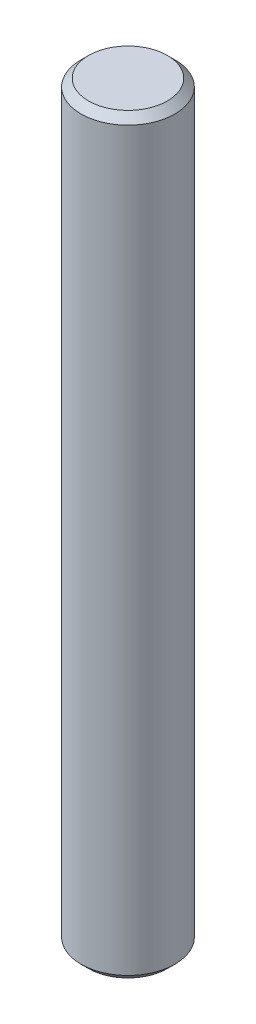
ISO-10303-21;
HEADER;
FILE_DESCRIPTION(('STEP AP214'),'2;1');
FILE_NAME('part.step','',(''),(''),'','','');
FILE_SCHEMA(('AUTOMOTIVE_DESIGN { 1 0 10303 214 1 1 1 1 }'));
ENDSEC;
DATA;
#1=APPLICATION_CONTEXT('core data for automotive mechanical design processes');
#2=APPLICATION_PROTOCOL_DEFINITION('international standard','automotive_design',2000,#1);
#3=PRODUCT_CONTEXT('',#1,'mechanical');
#4=PRODUCT('Part','Part','',(#3));
#5=PRODUCT_RELATED_PRODUCT_CATEGORY('part','',(#4));
#6=PRODUCT_DEFINITION_FORMATION('','',#4);
#7=PRODUCT_DEFINITION_CONTEXT('part definition',#1,'design');
#8=PRODUCT_DEFINITION('design','',#6,#7);
#9=PRODUCT_DEFINITION_SHAPE('','',#8);
#10=(LENGTH_UNIT() NAMED_UNIT(*) SI_UNIT(.MILLI.,.METRE.));
#11=(NAMED_UNIT(*) PLANE_ANGLE_UNIT() SI_UNIT($,.RADIAN.));
#12=(NAMED_UNIT(*) SI_UNIT($,.STERADIAN.) SOLID_ANGLE_UNIT());
#13=UNCERTAINTY_MEASURE_WITH_UNIT(LENGTH_MEASURE(1.E-05),#10,'distance_accuracy_value','');
#14=(GEOMETRIC_REPRESENTATION_CONTEXT(3) GLOBAL_UNCERTAINTY_ASSIGNED_CONTEXT((#13)) GLOBAL_UNIT_ASSIGNED_CONTEXT((#10,
#11,#12)) REPRESENTATION_CONTEXT('',''));
#15=CARTESIAN_POINT('',(0.,0.,0.));
#16=DIRECTION('',(0.,0.,1.));
#17=DIRECTION('',(1.,0.,0.));
#18=AXIS2_PLACEMENT_3D('',#15,#16,#17);
#19=CARTESIAN_POINT('',(0.,200.,0.));
#20=DIRECTION('',(0.,-1.,0.));
#21=DIRECTION('',(0.,0.,-1.));
#22=AXIS2_PLACEMENT_3D('',#19,#20,#21);
#23=CYLINDRICAL_SURFACE('',#22,12.5);
#24=CARTESIAN_POINT('',(0.,2.00000000000003,0.));
#25=DIRECTION('',(0.,1.,0.));
#26=DIRECTION('',(0.,0.,1.));
#27=AXIS2_PLACEMENT_3D('',#24,#25,#26);
#28=CIRCLE('',#27,12.5);
#29=CARTESIAN_POINT('',(0.,2.00000000000003,12.5));
#30=VERTEX_POINT('',#29);
#31=EDGE_CURVE('E49',#30,#30,#28,.T.);
#32=ORIENTED_EDGE('',*,*,#31,.T.);
#33=EDGE_LOOP('',(#32));
#34=FACE_BOUND('',#33,.T.);
#35=CARTESIAN_POINT('',(0.,198.,0.));
#36=DIRECTION('',(0.,1.,0.));
#37=DIRECTION('',(0.,0.,1.));
#38=AXIS2_PLACEMENT_3D('',#35,#36,#37);
#39=CIRCLE('',#38,12.5);
#40=CARTESIAN_POINT('',(0.,198.,12.5));
#41=VERTEX_POINT('',#40);
#42=EDGE_CURVE('E53',#41,#41,#39,.F.);
#43=ORIENTED_EDGE('',*,*,#42,.T.);
#44=EDGE_LOOP('',(#43));
#45=FACE_BOUND('',#44,.T.);
#46=ADVANCED_FACE('F37',(#34,#45),#23,.T.);
#47=CARTESIAN_POINT('',(0.,200.,0.));
#48=DIRECTION('',(0.,1.,0.));
#49=DIRECTION('',(0.,0.,1.));
#50=AXIS2_PLACEMENT_3D('',#47,#48,#49);
#51=PLANE('',#50);
#52=CARTESIAN_POINT('',(0.,200.,0.));
#53=DIRECTION('',(0.,1.,0.));
#54=DIRECTION('',(0.,0.,1.));
#55=AXIS2_PLACEMENT_3D('',#52,#53,#54);
#56=CIRCLE('',#55,10.5);
#57=CARTESIAN_POINT('',(0.,200.,10.5));
#58=VERTEX_POINT('',#57);
#59=EDGE_CURVE('E10',#58,#58,#56,.T.);
#60=ORIENTED_EDGE('',*,*,#59,.T.);
#61=EDGE_LOOP('',(#60));
#62=FACE_BOUND('',#61,.T.);
#63=ADVANCED_FACE('F69',(#62),#51,.T.);
#64=CARTESIAN_POINT('',(0.,0.,0.));
#65=DIRECTION('',(0.,1.,0.));
#66=DIRECTION('',(0.,0.,1.));
#67=AXIS2_PLACEMENT_3D('',#64,#65,#66);
#68=PLANE('',#67);
#69=CARTESIAN_POINT('',(0.,0.,0.));
#70=DIRECTION('',(0.,1.,0.));
#71=DIRECTION('',(0.,0.,1.));
#72=AXIS2_PLACEMENT_3D('',#69,#70,#71);
#73=CIRCLE('',#72,10.5);
#74=CARTESIAN_POINT('',(0.,0.,10.5));
#75=VERTEX_POINT('',#74);
#76=EDGE_CURVE('E45',#75,#75,#73,.F.);
#77=ORIENTED_EDGE('',*,*,#76,.T.);
#78=EDGE_LOOP('',(#77));
#79=FACE_BOUND('',#78,.T.);
#80=ADVANCED_FACE('F66',(#79),#68,.F.);
#81=CARTESIAN_POINT('',(0.,2.00000000000003,0.));
#82=DIRECTION('',(0.,1.,0.));
#83=DIRECTION('',(0.,0.,1.));
#84=AXIS2_PLACEMENT_3D('',#81,#82,#83);
#85=CONICAL_SURFACE('',#84,12.5,0.785398163397446);
#86=ORIENTED_EDGE('',*,*,#76,.F.);
#87=EDGE_LOOP('',(#86));
#88=FACE_BOUND('',#87,.T.);
#89=ORIENTED_EDGE('',*,*,#31,.F.);
#90=EDGE_LOOP('',(#89));
#91=FACE_BOUND('',#90,.T.);
#92=ADVANCED_FACE('F62',(#88,#91),#85,.T.);
#93=CARTESIAN_POINT('',(0.,200.,0.));
#94=DIRECTION('',(0.,-1.,0.));
#95=DIRECTION('',(0.,0.,-1.));
#96=AXIS2_PLACEMENT_3D('',#93,#94,#95);
#97=CONICAL_SURFACE('',#96,10.5,0.785398163397446);
#98=ORIENTED_EDGE('',*,*,#42,.F.);
#99=EDGE_LOOP('',(#98));
#100=FACE_BOUND('',#99,.T.);
#101=ORIENTED_EDGE('',*,*,#59,.F.);
#102=EDGE_LOOP('',(#101));
#103=FACE_BOUND('',#102,.T.);
#104=ADVANCED_FACE('F40',(#100,#103),#97,.T.);
#105=CLOSED_SHELL('',(#46,#63,#80,#92,#104));
#106=MANIFOLD_SOLID_BREP('B2',#105);
#107=ADVANCED_BREP_SHAPE_REPRESENTATION('',(#18,#106),#14);
#108=SHAPE_DEFINITION_REPRESENTATION(#9,#107);
ENDSEC;
END-ISO-10303-21;
